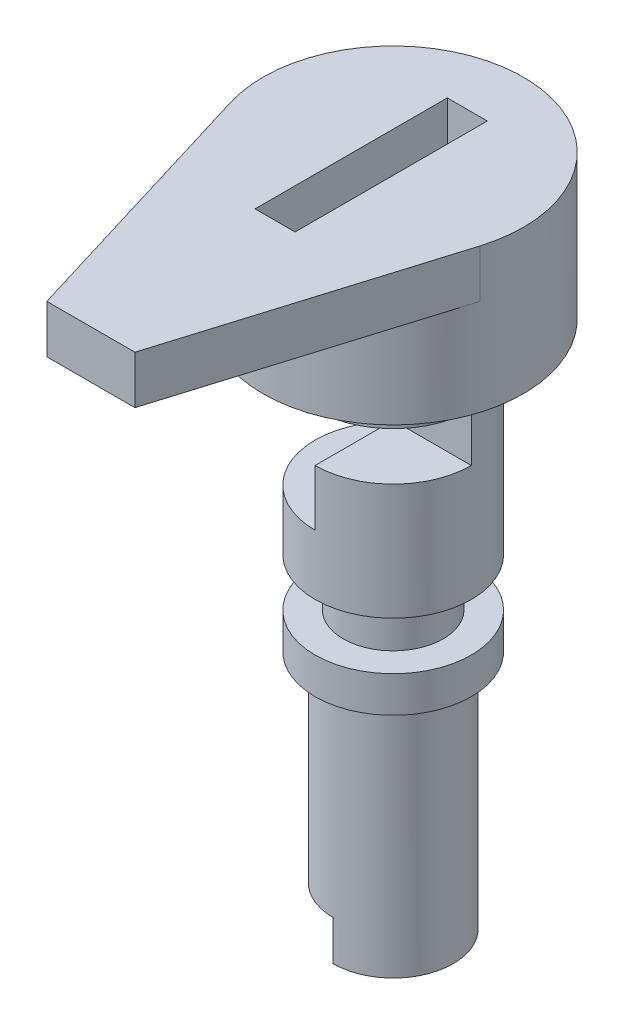
ISO-10303-21;
HEADER;
FILE_DESCRIPTION(('STEP AP214'),'2;1');
FILE_NAME('part.step','',(''),(''),'','','');
FILE_SCHEMA(('AUTOMOTIVE_DESIGN { 1 0 10303 214 1 1 1 1 }'));
ENDSEC;
DATA;
#1=APPLICATION_CONTEXT('core data for automotive mechanical design processes');
#2=APPLICATION_PROTOCOL_DEFINITION('international standard','automotive_design',2000,#1);
#3=PRODUCT_CONTEXT('',#1,'mechanical');
#4=PRODUCT('Part','Part','',(#3));
#5=PRODUCT_RELATED_PRODUCT_CATEGORY('part','',(#4));
#6=PRODUCT_DEFINITION_FORMATION('','',#4);
#7=PRODUCT_DEFINITION_CONTEXT('part definition',#1,'design');
#8=PRODUCT_DEFINITION('design','',#6,#7);
#9=PRODUCT_DEFINITION_SHAPE('','',#8);
#10=(LENGTH_UNIT() NAMED_UNIT(*) SI_UNIT(.MILLI.,.METRE.));
#11=(NAMED_UNIT(*) PLANE_ANGLE_UNIT() SI_UNIT($,.RADIAN.));
#12=(NAMED_UNIT(*) SI_UNIT($,.STERADIAN.) SOLID_ANGLE_UNIT());
#13=UNCERTAINTY_MEASURE_WITH_UNIT(LENGTH_MEASURE(1.E-05),#10,'distance_accuracy_value','');
#14=(GEOMETRIC_REPRESENTATION_CONTEXT(3) GLOBAL_UNCERTAINTY_ASSIGNED_CONTEXT((#13)) GLOBAL_UNIT_ASSIGNED_CONTEXT((#10,
#11,#12)) REPRESENTATION_CONTEXT('',''));
#15=CARTESIAN_POINT('',(0.,0.,0.));
#16=DIRECTION('',(0.,0.,1.));
#17=DIRECTION('',(1.,0.,0.));
#18=AXIS2_PLACEMENT_3D('',#15,#16,#17);
#19=CARTESIAN_POINT('',(0.,-13.2,0.));
#20=DIRECTION('',(0.,1.,0.));
#21=DIRECTION('',(0.,0.,1.));
#22=AXIS2_PLACEMENT_3D('',#19,#20,#21);
#23=CYLINDRICAL_SURFACE('',#22,1.5);
#24=CARTESIAN_POINT('',(0.,-7.2,0.));
#25=DIRECTION('',(0.,-1.,0.));
#26=DIRECTION('',(0.,0.,-1.));
#27=AXIS2_PLACEMENT_3D('',#24,#25,#26);
#28=CIRCLE('',#27,1.5);
#29=CARTESIAN_POINT('',(0.,-7.2,-1.5));
#30=VERTEX_POINT('',#29);
#31=EDGE_CURVE('E10',#30,#30,#28,.T.);
#32=ORIENTED_EDGE('',*,*,#31,.T.);
#33=EDGE_LOOP('',(#32));
#34=FACE_BOUND('',#33,.T.);
#35=DIRECTION('',(0.,-1.,0.));
#36=VECTOR('',#35,1.);
#37=CARTESIAN_POINT('',(0.,-12.2,-1.5));
#38=LINE('',#37,#36);
#39=CARTESIAN_POINT('',(0.,-12.2,-1.5));
#40=VERTEX_POINT('',#39);
#41=CARTESIAN_POINT('',(0.,-13.2,-1.5));
#42=VERTEX_POINT('',#41);
#43=EDGE_CURVE('E169',#40,#42,#38,.T.);
#44=ORIENTED_EDGE('',*,*,#43,.F.);
#45=CARTESIAN_POINT('',(0.,-12.2,0.));
#46=DIRECTION('',(0.,1.,0.));
#47=DIRECTION('',(0.,0.,1.));
#48=AXIS2_PLACEMENT_3D('',#45,#46,#47);
#49=CIRCLE('',#48,1.5);
#50=CARTESIAN_POINT('',(0.,-12.2,1.5));
#51=VERTEX_POINT('',#50);
#52=EDGE_CURVE('E176',#40,#51,#49,.T.);
#53=ORIENTED_EDGE('',*,*,#52,.T.);
#54=DIRECTION('',(0.,-1.,0.));
#55=VECTOR('',#54,1.);
#56=CARTESIAN_POINT('',(0.,-12.2,1.5));
#57=LINE('',#56,#55);
#58=CARTESIAN_POINT('',(0.,-13.2,1.5));
#59=VERTEX_POINT('',#58);
#60=EDGE_CURVE('E159',#51,#59,#57,.T.);
#61=ORIENTED_EDGE('',*,*,#60,.T.);
#62=CARTESIAN_POINT('',(0.,-13.2,0.));
#63=DIRECTION('',(0.,-1.,0.));
#64=DIRECTION('',(0.,0.,-1.));
#65=AXIS2_PLACEMENT_3D('',#62,#63,#64);
#66=CIRCLE('',#65,1.5);
#67=EDGE_CURVE('E209',#42,#59,#66,.T.);
#68=ORIENTED_EDGE('',*,*,#67,.F.);
#69=EDGE_LOOP('',(#44,#53,#61,#68));
#70=FACE_BOUND('',#69,.T.);
#71=ADVANCED_FACE('F16',(#34,#70),#23,.T.);
#72=CARTESIAN_POINT('',(0.,-13.2,0.));
#73=DIRECTION('',(0.,-1.,0.));
#74=DIRECTION('',(0.,0.,-1.));
#75=AXIS2_PLACEMENT_3D('',#72,#73,#74);
#76=PLANE('',#75);
#77=CARTESIAN_POINT('',(0.,-13.2,0.));
#78=DIRECTION('',(0.,1.,0.));
#79=DIRECTION('',(0.,0.,1.));
#80=AXIS2_PLACEMENT_3D('',#77,#78,#79);
#81=CIRCLE('',#80,0.01);
#82=CARTESIAN_POINT('',(0.,-13.2,-0.01));
#83=VERTEX_POINT('',#82);
#84=CARTESIAN_POINT('',(0.,-13.2,0.01));
#85=VERTEX_POINT('',#84);
#86=EDGE_CURVE('E179',#83,#85,#81,.T.);
#87=ORIENTED_EDGE('',*,*,#86,.F.);
#88=DIRECTION('',(0.,0.,1.));
#89=VECTOR('',#88,1.);
#90=CARTESIAN_POINT('',(0.,-13.2,-1.5));
#91=LINE('',#90,#89);
#92=EDGE_CURVE('E171',#42,#83,#91,.T.);
#93=ORIENTED_EDGE('',*,*,#92,.F.);
#94=ORIENTED_EDGE('',*,*,#67,.T.);
#95=DIRECTION('',(0.,0.,-1.));
#96=VECTOR('',#95,1.);
#97=CARTESIAN_POINT('',(0.,-13.2,1.5));
#98=LINE('',#97,#96);
#99=EDGE_CURVE('E165',#59,#85,#98,.T.);
#100=ORIENTED_EDGE('',*,*,#99,.T.);
#101=EDGE_LOOP('',(#87,#93,#94,#100));
#102=FACE_BOUND('',#101,.T.);
#103=ADVANCED_FACE('F296',(#102),#76,.T.);
#104=CARTESIAN_POINT('',(0.,2.4,0.));
#105=DIRECTION('',(0.,-1.,0.));
#106=DIRECTION('',(0.,0.,-1.));
#107=AXIS2_PLACEMENT_3D('',#104,#105,#106);
#108=CYLINDRICAL_SURFACE('',#107,3.25);
#109=CARTESIAN_POINT('',(0.,2.4,0.));
#110=DIRECTION('',(0.,1.,0.));
#111=DIRECTION('',(0.,0.,1.));
#112=AXIS2_PLACEMENT_3D('',#109,#110,#111);
#113=CIRCLE('',#112,3.25);
#114=CARTESIAN_POINT('',(-3.10927392322903,2.4,0.94599982575471));
#115=VERTEX_POINT('',#114);
#116=CARTESIAN_POINT('',(3.10927392322903,2.4,0.94599982575471));
#117=VERTEX_POINT('',#116);
#118=EDGE_CURVE('E250',#115,#117,#113,.T.);
#119=ORIENTED_EDGE('',*,*,#118,.F.);
#120=DIRECTION('',(0.,-1.,0.));
#121=VECTOR('',#120,1.);
#122=CARTESIAN_POINT('',(-3.10927392322903,3.6,0.94599982575471));
#123=LINE('',#122,#121);
#124=CARTESIAN_POINT('',(-3.10927392322903,3.6,0.94599982575471));
#125=VERTEX_POINT('',#124);
#126=EDGE_CURVE('E206',#125,#115,#123,.T.);
#127=ORIENTED_EDGE('',*,*,#126,.F.);
#128=CARTESIAN_POINT('',(0.,3.6,0.));
#129=DIRECTION('',(0.,1.,0.));
#130=DIRECTION('',(0.,0.,1.));
#131=AXIS2_PLACEMENT_3D('',#128,#129,#130);
#132=CIRCLE('',#131,3.25);
#133=CARTESIAN_POINT('',(3.10927392322903,3.6,0.94599982575471));
#134=VERTEX_POINT('',#133);
#135=EDGE_CURVE('E182',#134,#125,#132,.T.);
#136=ORIENTED_EDGE('',*,*,#135,.F.);
#137=DIRECTION('',(0.,-1.,0.));
#138=VECTOR('',#137,1.);
#139=CARTESIAN_POINT('',(3.10927392322903,3.6,0.94599982575471));
#140=LINE('',#139,#138);
#141=EDGE_CURVE('E192',#134,#117,#140,.T.);
#142=ORIENTED_EDGE('',*,*,#141,.T.);
#143=EDGE_LOOP('',(#119,#127,#136,#142));
#144=FACE_BOUND('',#143,.T.);
#145=CARTESIAN_POINT('',(0.,0.,0.));
#146=DIRECTION('',(0.,1.,0.));
#147=DIRECTION('',(0.,0.,1.));
#148=AXIS2_PLACEMENT_3D('',#145,#146,#147);
#149=CIRCLE('',#148,3.25);
#150=CARTESIAN_POINT('',(0.,0.,3.25));
#151=VERTEX_POINT('',#150);
#152=EDGE_CURVE('E245',#151,#151,#149,.T.);
#153=ORIENTED_EDGE('',*,*,#152,.T.);
#154=EDGE_LOOP('',(#153));
#155=FACE_BOUND('',#154,.T.);
#156=ADVANCED_FACE('F18',(#144,#155),#108,.T.);
#157=CARTESIAN_POINT('',(0.,0.,0.));
#158=DIRECTION('',(0.,1.,0.));
#159=DIRECTION('',(0.,0.,1.));
#160=AXIS2_PLACEMENT_3D('',#157,#158,#159);
#161=PLANE('',#160);
#162=CARTESIAN_POINT('',(0.,0.,0.));
#163=DIRECTION('',(0.,-1.,0.));
#164=DIRECTION('',(0.,0.,-1.));
#165=AXIS2_PLACEMENT_3D('',#162,#163,#164);
#166=CIRCLE('',#165,1.95);
#167=CARTESIAN_POINT('',(0.,0.,-1.95));
#168=VERTEX_POINT('',#167);
#169=EDGE_CURVE('E246',#168,#168,#166,.T.);
#170=ORIENTED_EDGE('',*,*,#169,.F.);
#171=EDGE_LOOP('',(#170));
#172=FACE_BOUND('',#171,.T.);
#173=ORIENTED_EDGE('',*,*,#152,.F.);
#174=EDGE_LOOP('',(#173));
#175=FACE_BOUND('',#174,.T.);
#176=ADVANCED_FACE('F328',(#172,#175),#161,.F.);
#177=CARTESIAN_POINT('',(0.,-7.2,0.));
#178=DIRECTION('',(0.,1.,0.));
#179=DIRECTION('',(0.,0.,1.));
#180=AXIS2_PLACEMENT_3D('',#177,#178,#179);
#181=CYLINDRICAL_SURFACE('',#180,1.95);
#182=CARTESIAN_POINT('',(0.,-5.1,0.));
#183=DIRECTION('',(0.,1.,0.));
#184=DIRECTION('',(0.,0.,1.));
#185=AXIS2_PLACEMENT_3D('',#182,#183,#184);
#186=CIRCLE('',#185,1.95);
#187=CARTESIAN_POINT('',(0.,-5.1,1.95));
#188=VERTEX_POINT('',#187);
#189=EDGE_CURVE('E211',#188,#188,#186,.T.);
#190=ORIENTED_EDGE('',*,*,#189,.T.);
#191=EDGE_LOOP('',(#190));
#192=FACE_BOUND('',#191,.T.);
#193=CARTESIAN_POINT('',(0.,-1.,0.));
#194=DIRECTION('',(0.,1.,0.));
#195=DIRECTION('',(-1.,0.,0.));
#196=AXIS2_PLACEMENT_3D('',#193,#194,#195);
#197=CIRCLE('',#196,1.95);
#198=CARTESIAN_POINT('',(0.,-1.,-1.95));
#199=VERTEX_POINT('',#198);
#200=CARTESIAN_POINT('',(1.95,-1.,0.));
#201=VERTEX_POINT('',#200);
#202=EDGE_CURVE('E261',#199,#201,#197,.T.);
#203=ORIENTED_EDGE('',*,*,#202,.T.);
#204=DIRECTION('',(0.,1.,0.));
#205=VECTOR('',#204,1.);
#206=CARTESIAN_POINT('',(1.95,-7.2,0.));
#207=LINE('',#206,#205);
#208=CARTESIAN_POINT('',(1.95,-2.2,0.));
#209=VERTEX_POINT('',#208);
#210=EDGE_CURVE('E233',#201,#209,#207,.F.);
#211=ORIENTED_EDGE('',*,*,#210,.T.);
#212=CARTESIAN_POINT('',(0.,-2.2,0.));
#213=DIRECTION('',(0.,-1.,0.));
#214=DIRECTION('',(0.,0.,-1.));
#215=AXIS2_PLACEMENT_3D('',#212,#213,#214);
#216=CIRCLE('',#215,1.95);
#217=CARTESIAN_POINT('',(0.,-2.2,1.95));
#218=VERTEX_POINT('',#217);
#219=EDGE_CURVE('E228',#209,#218,#216,.T.);
#220=ORIENTED_EDGE('',*,*,#219,.T.);
#221=DIRECTION('',(0.,1.,0.));
#222=VECTOR('',#221,1.);
#223=CARTESIAN_POINT('',(0.,-7.2,1.95));
#224=LINE('',#223,#222);
#225=CARTESIAN_POINT('',(0.,-3.6,1.95));
#226=VERTEX_POINT('',#225);
#227=EDGE_CURVE('E256',#218,#226,#224,.F.);
#228=ORIENTED_EDGE('',*,*,#227,.T.);
#229=CARTESIAN_POINT('',(0.,-3.6,0.));
#230=DIRECTION('',(0.,-1.,0.));
#231=DIRECTION('',(0.,0.,-1.));
#232=AXIS2_PLACEMENT_3D('',#229,#230,#231);
#233=CIRCLE('',#232,1.95);
#234=CARTESIAN_POINT('',(0.,-3.6,-1.95));
#235=VERTEX_POINT('',#234);
#236=EDGE_CURVE('E249',#226,#235,#233,.T.);
#237=ORIENTED_EDGE('',*,*,#236,.T.);
#238=DIRECTION('',(0.,1.,0.));
#239=VECTOR('',#238,1.);
#240=CARTESIAN_POINT('',(0.,-7.2,-1.95));
#241=LINE('',#240,#239);
#242=EDGE_CURVE('E258',#235,#199,#241,.T.);
#243=ORIENTED_EDGE('',*,*,#242,.T.);
#244=EDGE_LOOP('',(#203,#211,#220,#228,#237,#243));
#245=FACE_BOUND('',#244,.T.);
#246=ORIENTED_EDGE('',*,*,#169,.T.);
#247=EDGE_LOOP('',(#246));
#248=FACE_BOUND('',#247,.T.);
#249=ADVANCED_FACE('F276',(#192,#245,#248),#181,.T.);
#250=CARTESIAN_POINT('',(0.,-1.,-3.25));
#251=DIRECTION('',(0.,1.,0.));
#252=DIRECTION('',(-1.,0.,0.));
#253=AXIS2_PLACEMENT_3D('',#250,#251,#252);
#254=PLANE('',#253);
#255=DIRECTION('',(0.,0.,1.));
#256=VECTOR('',#255,1.);
#257=CARTESIAN_POINT('',(0.,-1.,-3.25));
#258=LINE('',#257,#256);
#259=CARTESIAN_POINT('',(0.,-1.,0.));
#260=VERTEX_POINT('',#259);
#261=EDGE_CURVE('E237',#199,#260,#258,.T.);
#262=ORIENTED_EDGE('',*,*,#261,.T.);
#263=DIRECTION('',(1.,0.,0.));
#264=VECTOR('',#263,1.);
#265=CARTESIAN_POINT('',(-3.25,-1.,0.));
#266=LINE('',#265,#264);
#267=EDGE_CURVE('E225',#260,#201,#266,.T.);
#268=ORIENTED_EDGE('',*,*,#267,.T.);
#269=ORIENTED_EDGE('',*,*,#202,.F.);
#270=EDGE_LOOP('',(#262,#268,#269));
#271=FACE_BOUND('',#270,.T.);
#272=ADVANCED_FACE('F273',(#271),#254,.F.);
#273=CARTESIAN_POINT('',(0.,-3.6,-3.25));
#274=DIRECTION('',(1.,0.,0.));
#275=DIRECTION('',(0.,1.,0.));
#276=AXIS2_PLACEMENT_3D('',#273,#274,#275);
#277=PLANE('',#276);
#278=DIRECTION('',(0.,0.,-1.));
#279=VECTOR('',#278,1.);
#280=CARTESIAN_POINT('',(0.,-2.2,-3.25));
#281=LINE('',#280,#279);
#282=CARTESIAN_POINT('',(0.,-2.2,0.));
#283=VERTEX_POINT('',#282);
#284=EDGE_CURVE('E262',#218,#283,#281,.T.);
#285=ORIENTED_EDGE('',*,*,#284,.T.);
#286=DIRECTION('',(0.,1.,0.));
#287=VECTOR('',#286,1.);
#288=CARTESIAN_POINT('',(0.,-3.6,0.));
#289=LINE('',#288,#287);
#290=EDGE_CURVE('E20',#283,#260,#289,.T.);
#291=ORIENTED_EDGE('',*,*,#290,.T.);
#292=ORIENTED_EDGE('',*,*,#261,.F.);
#293=ORIENTED_EDGE('',*,*,#242,.F.);
#294=DIRECTION('',(0.,0.,1.));
#295=VECTOR('',#294,1.);
#296=CARTESIAN_POINT('',(0.,-3.6,-3.25));
#297=LINE('',#296,#295);
#298=EDGE_CURVE('E236',#235,#226,#297,.T.);
#299=ORIENTED_EDGE('',*,*,#298,.T.);
#300=ORIENTED_EDGE('',*,*,#227,.F.);
#301=EDGE_LOOP('',(#285,#291,#292,#293,#299,#300));
#302=FACE_BOUND('',#301,.T.);
#303=ADVANCED_FACE('F269',(#302),#277,.F.);
#304=CARTESIAN_POINT('',(0.,-3.6,-3.25));
#305=DIRECTION('',(0.,-1.,0.));
#306=DIRECTION('',(0.,0.,-1.));
#307=AXIS2_PLACEMENT_3D('',#304,#305,#306);
#308=PLANE('',#307);
#309=ORIENTED_EDGE('',*,*,#298,.F.);
#310=ORIENTED_EDGE('',*,*,#236,.F.);
#311=EDGE_LOOP('',(#309,#310));
#312=FACE_BOUND('',#311,.T.);
#313=ADVANCED_FACE('F283',(#312),#308,.F.);
#314=CARTESIAN_POINT('',(-3.25,-2.2,0.));
#315=DIRECTION('',(0.,0.,-1.));
#316=DIRECTION('',(-1.,0.,0.));
#317=AXIS2_PLACEMENT_3D('',#314,#315,#316);
#318=PLANE('',#317);
#319=ORIENTED_EDGE('',*,*,#267,.F.);
#320=ORIENTED_EDGE('',*,*,#290,.F.);
#321=DIRECTION('',(1.,0.,0.));
#322=VECTOR('',#321,1.);
#323=CARTESIAN_POINT('',(-3.25,-2.2,0.));
#324=LINE('',#323,#322);
#325=EDGE_CURVE('E224',#283,#209,#324,.T.);
#326=ORIENTED_EDGE('',*,*,#325,.T.);
#327=ORIENTED_EDGE('',*,*,#210,.F.);
#328=EDGE_LOOP('',(#319,#320,#326,#327));
#329=FACE_BOUND('',#328,.T.);
#330=ADVANCED_FACE('F278',(#329),#318,.F.);
#331=CARTESIAN_POINT('',(-3.25,-2.2,0.));
#332=DIRECTION('',(0.,-1.,0.));
#333=DIRECTION('',(0.,0.,-1.));
#334=AXIS2_PLACEMENT_3D('',#331,#332,#333);
#335=PLANE('',#334);
#336=ORIENTED_EDGE('',*,*,#325,.F.);
#337=ORIENTED_EDGE('',*,*,#284,.F.);
#338=ORIENTED_EDGE('',*,*,#219,.F.);
#339=EDGE_LOOP('',(#336,#337,#338));
#340=FACE_BOUND('',#339,.T.);
#341=ADVANCED_FACE('F280',(#340),#335,.F.);
#342=CARTESIAN_POINT('',(-1.95,-6.3,0.));
#343=DIRECTION('',(0.,-1.,0.));
#344=DIRECTION('',(0.,0.,-1.));
#345=AXIS2_PLACEMENT_3D('',#342,#343,#344);
#346=PLANE('',#345);
#347=CARTESIAN_POINT('',(0.,-6.3,0.));
#348=DIRECTION('',(0.,1.,0.));
#349=DIRECTION('',(0.,0.,1.));
#350=AXIS2_PLACEMENT_3D('',#347,#348,#349);
#351=CIRCLE('',#350,1.25);
#352=CARTESIAN_POINT('',(0.,-6.3,1.25));
#353=VERTEX_POINT('',#352);
#354=EDGE_CURVE('E218',#353,#353,#351,.T.);
#355=ORIENTED_EDGE('',*,*,#354,.F.);
#356=EDGE_LOOP('',(#355));
#357=FACE_BOUND('',#356,.T.);
#358=CARTESIAN_POINT('',(0.,-6.3,0.));
#359=DIRECTION('',(0.,1.,0.));
#360=DIRECTION('',(0.,0.,1.));
#361=AXIS2_PLACEMENT_3D('',#358,#359,#360);
#362=CIRCLE('',#361,1.95);
#363=CARTESIAN_POINT('',(0.,-6.3,1.95));
#364=VERTEX_POINT('',#363);
#365=EDGE_CURVE('E221',#364,#364,#362,.T.);
#366=ORIENTED_EDGE('',*,*,#365,.T.);
#367=EDGE_LOOP('',(#366));
#368=FACE_BOUND('',#367,.T.);
#369=ADVANCED_FACE('F316',(#357,#368),#346,.F.);
#370=CARTESIAN_POINT('',(0.,0.,0.));
#371=DIRECTION('',(0.,1.,0.));
#372=DIRECTION('',(0.,0.,1.));
#373=AXIS2_PLACEMENT_3D('',#370,#371,#372);
#374=CYLINDRICAL_SURFACE('',#373,1.25);
#375=CARTESIAN_POINT('',(0.,-5.1,0.));
#376=DIRECTION('',(0.,1.,0.));
#377=DIRECTION('',(0.,0.,1.));
#378=AXIS2_PLACEMENT_3D('',#375,#376,#377);
#379=CIRCLE('',#378,1.25);
#380=CARTESIAN_POINT('',(0.,-5.1,1.25));
#381=VERTEX_POINT('',#380);
#382=EDGE_CURVE('E215',#381,#381,#379,.T.);
#383=ORIENTED_EDGE('',*,*,#382,.F.);
#384=EDGE_LOOP('',(#383));
#385=FACE_BOUND('',#384,.T.);
#386=ORIENTED_EDGE('',*,*,#354,.T.);
#387=EDGE_LOOP('',(#386));
#388=FACE_BOUND('',#387,.T.);
#389=ADVANCED_FACE('F312',(#385,#388),#374,.T.);
#390=CARTESIAN_POINT('',(-1.95,-5.1,0.));
#391=DIRECTION('',(0.,1.,0.));
#392=DIRECTION('',(0.,0.,1.));
#393=AXIS2_PLACEMENT_3D('',#390,#391,#392);
#394=PLANE('',#393);
#395=ORIENTED_EDGE('',*,*,#189,.F.);
#396=EDGE_LOOP('',(#395));
#397=FACE_BOUND('',#396,.T.);
#398=ORIENTED_EDGE('',*,*,#382,.T.);
#399=EDGE_LOOP('',(#398));
#400=FACE_BOUND('',#399,.T.);
#401=ADVANCED_FACE('F308',(#397,#400),#394,.F.);
#402=CARTESIAN_POINT('',(0.,-7.2,0.));
#403=DIRECTION('',(0.,-1.,0.));
#404=DIRECTION('',(0.,0.,-1.));
#405=AXIS2_PLACEMENT_3D('',#402,#403,#404);
#406=PLANE('',#405);
#407=ORIENTED_EDGE('',*,*,#31,.F.);
#408=EDGE_LOOP('',(#407));
#409=FACE_BOUND('',#408,.T.);
#410=CARTESIAN_POINT('',(0.,-7.2,0.));
#411=DIRECTION('',(0.,-1.,0.));
#412=DIRECTION('',(0.,0.,-1.));
#413=AXIS2_PLACEMENT_3D('',#410,#411,#412);
#414=CIRCLE('',#413,1.95);
#415=CARTESIAN_POINT('',(0.,-7.2,-1.95));
#416=VERTEX_POINT('',#415);
#417=EDGE_CURVE('E240',#416,#416,#414,.T.);
#418=ORIENTED_EDGE('',*,*,#417,.T.);
#419=EDGE_LOOP('',(#418));
#420=FACE_BOUND('',#419,.T.);
#421=ADVANCED_FACE('F311',(#409,#420),#406,.T.);
#422=ORIENTED_EDGE('',*,*,#365,.F.);
#423=EDGE_LOOP('',(#422));
#424=FACE_BOUND('',#423,.T.);
#425=ORIENTED_EDGE('',*,*,#417,.F.);
#426=EDGE_LOOP('',(#425));
#427=FACE_BOUND('',#426,.T.);
#428=ADVANCED_FACE('F331',(#424,#427),#181,.T.);
#429=CARTESIAN_POINT('',(0.,2.4,0.));
#430=DIRECTION('',(0.,1.,0.));
#431=DIRECTION('',(0.,0.,1.));
#432=AXIS2_PLACEMENT_3D('',#429,#430,#431);
#433=PLANE('',#432);
#434=DIRECTION('',(0.291076869462988,0.,0.956699668685856));
#435=VECTOR('',#434,1.);
#436=CARTESIAN_POINT('',(-3.10927392322903,2.4,0.94599982575471));
#437=LINE('',#436,#435);
#438=CARTESIAN_POINT('',(-1.1,2.4,7.55));
#439=VERTEX_POINT('',#438);
#440=EDGE_CURVE('E181',#115,#439,#437,.T.);
#441=ORIENTED_EDGE('',*,*,#440,.F.);
#442=ORIENTED_EDGE('',*,*,#118,.T.);
#443=DIRECTION('',(0.291076869462988,0.,-0.956699668685856));
#444=VECTOR('',#443,1.);
#445=CARTESIAN_POINT('',(1.1,2.4,7.55));
#446=LINE('',#445,#444);
#447=CARTESIAN_POINT('',(1.1,2.4,7.55));
#448=VERTEX_POINT('',#447);
#449=EDGE_CURVE('E186',#448,#117,#446,.T.);
#450=ORIENTED_EDGE('',*,*,#449,.F.);
#451=DIRECTION('',(1.,0.,0.));
#452=VECTOR('',#451,1.);
#453=CARTESIAN_POINT('',(-1.1,2.4,7.55));
#454=LINE('',#453,#452);
#455=EDGE_CURVE('E194',#439,#448,#454,.T.);
#456=ORIENTED_EDGE('',*,*,#455,.F.);
#457=EDGE_LOOP('',(#441,#442,#450,#456));
#458=FACE_BOUND('',#457,.T.);
#459=ADVANCED_FACE('F338',(#458),#433,.F.);
#460=CARTESIAN_POINT('',(-3.10927392322903,3.6,0.94599982575471));
#461=DIRECTION('',(0.956699668685856,0.,-0.291076869462988));
#462=DIRECTION('',(-0.291076869462988,0.,-0.956699668685856));
#463=AXIS2_PLACEMENT_3D('',#460,#461,#462);
#464=PLANE('',#463);
#465=ORIENTED_EDGE('',*,*,#440,.T.);
#466=DIRECTION('',(0.,-1.,0.));
#467=VECTOR('',#466,1.);
#468=CARTESIAN_POINT('',(-1.1,3.6,7.55));
#469=LINE('',#468,#467);
#470=CARTESIAN_POINT('',(-1.1,3.6,7.55));
#471=VERTEX_POINT('',#470);
#472=EDGE_CURVE('E203',#471,#439,#469,.T.);
#473=ORIENTED_EDGE('',*,*,#472,.F.);
#474=DIRECTION('',(0.291076869462988,0.,0.956699668685856));
#475=VECTOR('',#474,1.);
#476=CARTESIAN_POINT('',(-3.10927392322903,3.6,0.94599982575471));
#477=LINE('',#476,#475);
#478=EDGE_CURVE('E185',#125,#471,#477,.T.);
#479=ORIENTED_EDGE('',*,*,#478,.F.);
#480=ORIENTED_EDGE('',*,*,#126,.T.);
#481=EDGE_LOOP('',(#465,#473,#479,#480));
#482=FACE_BOUND('',#481,.T.);
#483=ADVANCED_FACE('F345',(#482),#464,.F.);
#484=CARTESIAN_POINT('',(-1.1,3.6,7.55));
#485=DIRECTION('',(0.,0.,-1.));
#486=DIRECTION('',(-1.,0.,0.));
#487=AXIS2_PLACEMENT_3D('',#484,#485,#486);
#488=PLANE('',#487);
#489=ORIENTED_EDGE('',*,*,#455,.T.);
#490=DIRECTION('',(0.,-1.,0.));
#491=VECTOR('',#490,1.);
#492=CARTESIAN_POINT('',(1.1,3.6,7.55));
#493=LINE('',#492,#491);
#494=CARTESIAN_POINT('',(1.1,3.6,7.55));
#495=VERTEX_POINT('',#494);
#496=EDGE_CURVE('E200',#495,#448,#493,.T.);
#497=ORIENTED_EDGE('',*,*,#496,.F.);
#498=DIRECTION('',(1.,0.,0.));
#499=VECTOR('',#498,1.);
#500=CARTESIAN_POINT('',(-1.1,3.6,7.55));
#501=LINE('',#500,#499);
#502=EDGE_CURVE('E188',#471,#495,#501,.T.);
#503=ORIENTED_EDGE('',*,*,#502,.F.);
#504=ORIENTED_EDGE('',*,*,#472,.T.);
#505=EDGE_LOOP('',(#489,#497,#503,#504));
#506=FACE_BOUND('',#505,.T.);
#507=ADVANCED_FACE('F443',(#506),#488,.F.);
#508=CARTESIAN_POINT('',(1.1,3.6,7.55));
#509=DIRECTION('',(-0.956699668685856,0.,-0.291076869462988));
#510=DIRECTION('',(-0.291076869462988,0.,0.956699668685856));
#511=AXIS2_PLACEMENT_3D('',#508,#509,#510);
#512=PLANE('',#511);
#513=ORIENTED_EDGE('',*,*,#449,.T.);
#514=ORIENTED_EDGE('',*,*,#141,.F.);
#515=DIRECTION('',(0.291076869462988,0.,-0.956699668685856));
#516=VECTOR('',#515,1.);
#517=CARTESIAN_POINT('',(1.1,3.6,7.55));
#518=LINE('',#517,#516);
#519=EDGE_CURVE('E190',#495,#134,#518,.T.);
#520=ORIENTED_EDGE('',*,*,#519,.F.);
#521=ORIENTED_EDGE('',*,*,#496,.T.);
#522=EDGE_LOOP('',(#513,#514,#520,#521));
#523=FACE_BOUND('',#522,.T.);
#524=ADVANCED_FACE('F451',(#523),#512,.F.);
#525=CARTESIAN_POINT('',(0.,3.6,0.));
#526=DIRECTION('',(0.,1.,0.));
#527=DIRECTION('',(0.,0.,1.));
#528=AXIS2_PLACEMENT_3D('',#525,#526,#527);
#529=PLANE('',#528);
#530=DIRECTION('',(0.,0.,-1.));
#531=VECTOR('',#530,1.);
#532=CARTESIAN_POINT('',(0.5,3.6,-1.85));
#533=LINE('',#532,#531);
#534=CARTESIAN_POINT('',(0.500000000000001,3.6,2.95));
#535=VERTEX_POINT('',#534);
#536=CARTESIAN_POINT('',(0.5,3.6,-1.85));
#537=VERTEX_POINT('',#536);
#538=EDGE_CURVE('E32',#535,#537,#533,.T.);
#539=ORIENTED_EDGE('',*,*,#538,.F.);
#540=DIRECTION('',(1.,0.,0.));
#541=VECTOR('',#540,1.);
#542=CARTESIAN_POINT('',(-0.500000000000001,3.6,2.95));
#543=LINE('',#542,#541);
#544=CARTESIAN_POINT('',(-0.500000000000001,3.6,2.95));
#545=VERTEX_POINT('',#544);
#546=EDGE_CURVE('E144',#545,#535,#543,.T.);
#547=ORIENTED_EDGE('',*,*,#546,.F.);
#548=DIRECTION('',(0.,0.,1.));
#549=VECTOR('',#548,1.);
#550=CARTESIAN_POINT('',(-0.5,3.6,-1.85));
#551=LINE('',#550,#549);
#552=CARTESIAN_POINT('',(-0.5,3.6,-1.85));
#553=VERTEX_POINT('',#552);
#554=EDGE_CURVE('E147',#553,#545,#551,.T.);
#555=ORIENTED_EDGE('',*,*,#554,.F.);
#556=DIRECTION('',(-1.,0.,0.));
#557=VECTOR('',#556,1.);
#558=CARTESIAN_POINT('',(-0.5,3.6,-1.85));
#559=LINE('',#558,#557);
#560=EDGE_CURVE('E153',#537,#553,#559,.T.);
#561=ORIENTED_EDGE('',*,*,#560,.F.);
#562=EDGE_LOOP('',(#539,#547,#555,#561));
#563=FACE_BOUND('',#562,.T.);
#564=ORIENTED_EDGE('',*,*,#135,.T.);
#565=ORIENTED_EDGE('',*,*,#478,.T.);
#566=ORIENTED_EDGE('',*,*,#502,.T.);
#567=ORIENTED_EDGE('',*,*,#519,.T.);
#568=EDGE_LOOP('',(#564,#565,#566,#567));
#569=FACE_BOUND('',#568,.T.);
#570=ADVANCED_FACE('F459',(#563,#569),#529,.T.);
#571=CARTESIAN_POINT('',(0.,-13.2,0.));
#572=DIRECTION('',(0.,1.,0.));
#573=DIRECTION('',(0.,0.,1.));
#574=AXIS2_PLACEMENT_3D('',#571,#572,#573);
#575=CONICAL_SURFACE('',#574,0.01,0.979702542984991);
#576=DIRECTION('',(0.,0.557269559388509,-0.830331643488876));
#577=VECTOR('',#576,1.);
#578=CARTESIAN_POINT('',(0.,-13.2,-0.01));
#579=LINE('',#578,#577);
#580=EDGE_CURVE('E173',#83,#40,#579,.T.);
#581=ORIENTED_EDGE('',*,*,#580,.F.);
#582=ORIENTED_EDGE('',*,*,#86,.T.);
#583=DIRECTION('',(0.,0.557269559388509,0.830331643488876));
#584=VECTOR('',#583,1.);
#585=CARTESIAN_POINT('',(0.,-13.2,0.01));
#586=LINE('',#585,#584);
#587=EDGE_CURVE('E40',#85,#51,#586,.T.);
#588=ORIENTED_EDGE('',*,*,#587,.T.);
#589=ORIENTED_EDGE('',*,*,#52,.F.);
#590=EDGE_LOOP('',(#581,#582,#588,#589));
#591=FACE_BOUND('',#590,.T.);
#592=ADVANCED_FACE('F467',(#591),#575,.T.);
#593=CARTESIAN_POINT('',(0.,0.,0.));
#594=DIRECTION('',(-1.,0.,0.));
#595=DIRECTION('',(0.,0.,1.));
#596=AXIS2_PLACEMENT_3D('',#593,#594,#595);
#597=PLANE('',#596);
#598=ORIENTED_EDGE('',*,*,#43,.T.);
#599=ORIENTED_EDGE('',*,*,#92,.T.);
#600=ORIENTED_EDGE('',*,*,#580,.T.);
#601=EDGE_LOOP('',(#598,#599,#600));
#602=FACE_BOUND('',#601,.T.);
#603=ADVANCED_FACE('F475',(#602),#597,.T.);
#604=CARTESIAN_POINT('',(0.,0.,0.));
#605=DIRECTION('',(1.,0.,0.));
#606=DIRECTION('',(0.,0.,-1.));
#607=AXIS2_PLACEMENT_3D('',#604,#605,#606);
#608=PLANE('',#607);
#609=ORIENTED_EDGE('',*,*,#60,.F.);
#610=ORIENTED_EDGE('',*,*,#587,.F.);
#611=ORIENTED_EDGE('',*,*,#99,.F.);
#612=EDGE_LOOP('',(#609,#610,#611));
#613=FACE_BOUND('',#612,.T.);
#614=ADVANCED_FACE('F483',(#613),#608,.F.);
#615=CARTESIAN_POINT('',(0.5,2.6,-1.85));
#616=DIRECTION('',(1.,0.,0.));
#617=DIRECTION('',(0.,0.,-1.));
#618=AXIS2_PLACEMENT_3D('',#615,#616,#617);
#619=PLANE('',#618);
#620=ORIENTED_EDGE('',*,*,#538,.T.);
#621=DIRECTION('',(0.,1.,0.));
#622=VECTOR('',#621,1.);
#623=CARTESIAN_POINT('',(0.5,2.6,-1.85));
#624=LINE('',#623,#622);
#625=CARTESIAN_POINT('',(0.5,2.6,-1.85));
#626=VERTEX_POINT('',#625);
#627=EDGE_CURVE('E122',#626,#537,#624,.T.);
#628=ORIENTED_EDGE('',*,*,#627,.F.);
#629=DIRECTION('',(0.,0.,-1.));
#630=VECTOR('',#629,1.);
#631=CARTESIAN_POINT('',(0.5,2.6,-1.85));
#632=LINE('',#631,#630);
#633=CARTESIAN_POINT('',(0.500000000000001,2.6,2.95));
#634=VERTEX_POINT('',#633);
#635=EDGE_CURVE('E126',#634,#626,#632,.T.);
#636=ORIENTED_EDGE('',*,*,#635,.F.);
#637=DIRECTION('',(0.,1.,0.));
#638=VECTOR('',#637,1.);
#639=CARTESIAN_POINT('',(0.500000000000001,2.6,2.95));
#640=LINE('',#639,#638);
#641=EDGE_CURVE('E157',#634,#535,#640,.T.);
#642=ORIENTED_EDGE('',*,*,#641,.T.);
#643=EDGE_LOOP('',(#620,#628,#636,#642));
#644=FACE_BOUND('',#643,.T.);
#645=ADVANCED_FACE('F124',(#644),#619,.F.);
#646=CARTESIAN_POINT('',(-0.500000000000001,2.6,2.95));
#647=DIRECTION('',(0.,0.,1.));
#648=DIRECTION('',(1.,0.,0.));
#649=AXIS2_PLACEMENT_3D('',#646,#647,#648);
#650=PLANE('',#649);
#651=ORIENTED_EDGE('',*,*,#546,.T.);
#652=ORIENTED_EDGE('',*,*,#641,.F.);
#653=DIRECTION('',(1.,0.,0.));
#654=VECTOR('',#653,1.);
#655=CARTESIAN_POINT('',(-0.500000000000001,2.6,2.95));
#656=LINE('',#655,#654);
#657=CARTESIAN_POINT('',(-0.500000000000001,2.6,2.95));
#658=VERTEX_POINT('',#657);
#659=EDGE_CURVE('E132',#658,#634,#656,.T.);
#660=ORIENTED_EDGE('',*,*,#659,.F.);
#661=DIRECTION('',(0.,1.,0.));
#662=VECTOR('',#661,1.);
#663=CARTESIAN_POINT('',(-0.500000000000001,2.6,2.95));
#664=LINE('',#663,#662);
#665=EDGE_CURVE('E160',#658,#545,#664,.T.);
#666=ORIENTED_EDGE('',*,*,#665,.T.);
#667=EDGE_LOOP('',(#651,#652,#660,#666));
#668=FACE_BOUND('',#667,.T.);
#669=ADVANCED_FACE('F497',(#668),#650,.F.);
#670=CARTESIAN_POINT('',(-0.5,2.6,-1.85));
#671=DIRECTION('',(-1.,0.,0.));
#672=DIRECTION('',(0.,0.,1.));
#673=AXIS2_PLACEMENT_3D('',#670,#671,#672);
#674=PLANE('',#673);
#675=ORIENTED_EDGE('',*,*,#554,.T.);
#676=ORIENTED_EDGE('',*,*,#665,.F.);
#677=DIRECTION('',(0.,0.,1.));
#678=VECTOR('',#677,1.);
#679=CARTESIAN_POINT('',(-0.5,2.6,-1.85));
#680=LINE('',#679,#678);
#681=CARTESIAN_POINT('',(-0.5,2.6,-1.85));
#682=VERTEX_POINT('',#681);
#683=EDGE_CURVE('E140',#682,#658,#680,.T.);
#684=ORIENTED_EDGE('',*,*,#683,.F.);
#685=DIRECTION('',(0.,1.,0.));
#686=VECTOR('',#685,1.);
#687=CARTESIAN_POINT('',(-0.5,2.6,-1.85));
#688=LINE('',#687,#686);
#689=EDGE_CURVE('E131',#682,#553,#688,.T.);
#690=ORIENTED_EDGE('',*,*,#689,.T.);
#691=EDGE_LOOP('',(#675,#676,#684,#690));
#692=FACE_BOUND('',#691,.T.);
#693=ADVANCED_FACE('F504',(#692),#674,.F.);
#694=CARTESIAN_POINT('',(-0.5,2.6,-1.85));
#695=DIRECTION('',(0.,0.,-1.));
#696=DIRECTION('',(-1.,0.,0.));
#697=AXIS2_PLACEMENT_3D('',#694,#695,#696);
#698=PLANE('',#697);
#699=ORIENTED_EDGE('',*,*,#560,.T.);
#700=ORIENTED_EDGE('',*,*,#689,.F.);
#701=DIRECTION('',(-1.,0.,0.));
#702=VECTOR('',#701,1.);
#703=CARTESIAN_POINT('',(-0.5,2.6,-1.85));
#704=LINE('',#703,#702);
#705=EDGE_CURVE('E135',#626,#682,#704,.T.);
#706=ORIENTED_EDGE('',*,*,#705,.F.);
#707=ORIENTED_EDGE('',*,*,#627,.T.);
#708=EDGE_LOOP('',(#699,#700,#706,#707));
#709=FACE_BOUND('',#708,.T.);
#710=ADVANCED_FACE('F136',(#709),#698,.F.);
#711=CARTESIAN_POINT('',(0.,2.6,0.));
#712=DIRECTION('',(0.,1.,0.));
#713=DIRECTION('',(0.,0.,1.));
#714=AXIS2_PLACEMENT_3D('',#711,#712,#713);
#715=PLANE('',#714);
#716=ORIENTED_EDGE('',*,*,#635,.T.);
#717=ORIENTED_EDGE('',*,*,#705,.T.);
#718=ORIENTED_EDGE('',*,*,#683,.T.);
#719=ORIENTED_EDGE('',*,*,#659,.T.);
#720=EDGE_LOOP('',(#716,#717,#718,#719));
#721=FACE_BOUND('',#720,.T.);
#722=ADVANCED_FACE('F142',(#721),#715,.T.);
#723=CLOSED_SHELL('',(#71,#103,#156,#176,#249,#272,#303,#313,#330,#341,#369,#389,#401,#421,#428,
#459,#483,#507,#524,#570,#592,#603,#614,#645,#669,#693,#710,#722));
#724=MANIFOLD_SOLID_BREP('B1',#723);
#725=ADVANCED_BREP_SHAPE_REPRESENTATION('',(#18,#724),#14);
#726=SHAPE_DEFINITION_REPRESENTATION(#9,#725);
ENDSEC;
END-ISO-10303-21;
